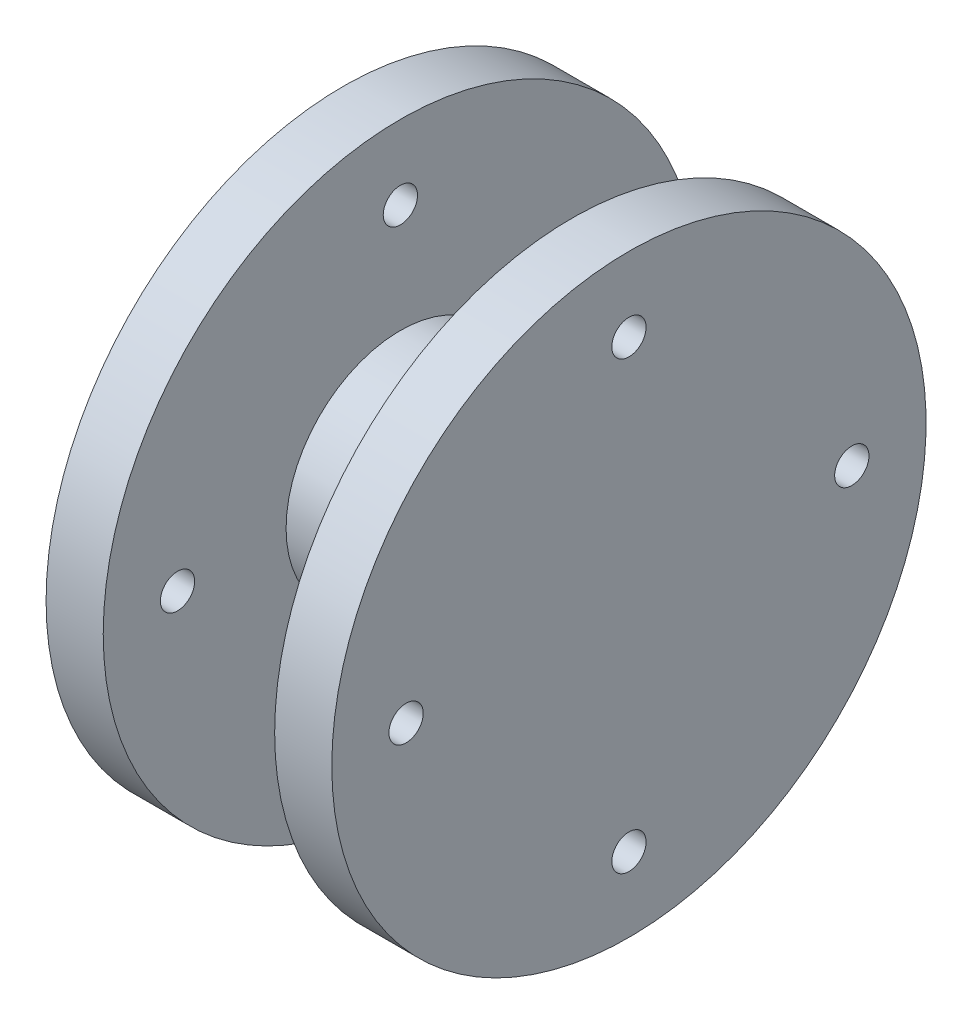
ISO-10303-21;
HEADER;
FILE_DESCRIPTION(('STEP AP214'),'2;1');
FILE_NAME('part.step','',(''),(''),'','','');
FILE_SCHEMA(('AUTOMOTIVE_DESIGN { 1 0 10303 214 1 1 1 1 }'));
ENDSEC;
DATA;
#1=APPLICATION_CONTEXT('core data for automotive mechanical design processes');
#2=APPLICATION_PROTOCOL_DEFINITION('international standard','automotive_design',2000,#1);
#3=PRODUCT_CONTEXT('',#1,'mechanical');
#4=PRODUCT('Part','Part','',(#3));
#5=PRODUCT_RELATED_PRODUCT_CATEGORY('part','',(#4));
#6=PRODUCT_DEFINITION_FORMATION('','',#4);
#7=PRODUCT_DEFINITION_CONTEXT('part definition',#1,'design');
#8=PRODUCT_DEFINITION('design','',#6,#7);
#9=PRODUCT_DEFINITION_SHAPE('','',#8);
#10=(LENGTH_UNIT() NAMED_UNIT(*) SI_UNIT(.MILLI.,.METRE.));
#11=(NAMED_UNIT(*) PLANE_ANGLE_UNIT() SI_UNIT($,.RADIAN.));
#12=(NAMED_UNIT(*) SI_UNIT($,.STERADIAN.) SOLID_ANGLE_UNIT());
#13=UNCERTAINTY_MEASURE_WITH_UNIT(LENGTH_MEASURE(1.E-05),#10,'distance_accuracy_value','');
#14=(GEOMETRIC_REPRESENTATION_CONTEXT(3) GLOBAL_UNCERTAINTY_ASSIGNED_CONTEXT((#13)) GLOBAL_UNIT_ASSIGNED_CONTEXT((#10,
#11,#12)) REPRESENTATION_CONTEXT('',''));
#15=CARTESIAN_POINT('',(0.,0.,0.));
#16=DIRECTION('',(0.,0.,1.));
#17=DIRECTION('',(1.,0.,0.));
#18=AXIS2_PLACEMENT_3D('',#15,#16,#17);
#19=CARTESIAN_POINT('',(0.,0.,0.));
#20=DIRECTION('',(1.,0.,0.));
#21=DIRECTION('',(0.,0.,-1.));
#22=AXIS2_PLACEMENT_3D('',#19,#20,#21);
#23=PLANE('',#22);
#24=CARTESIAN_POINT('',(0.,0.,-19.5));
#25=DIRECTION('',(-1.,0.,0.));
#26=DIRECTION('',(0.,1.,0.));
#27=AXIS2_PLACEMENT_3D('',#24,#25,#26);
#28=CIRCLE('',#27,1.5);
#29=CARTESIAN_POINT('',(0.,1.49999999999993,-19.5));
#30=VERTEX_POINT('',#29);
#31=EDGE_CURVE('E101',#30,#30,#28,.T.);
#32=ORIENTED_EDGE('',*,*,#31,.F.);
#33=EDGE_LOOP('',(#32));
#34=FACE_BOUND('',#33,.T.);
#35=CARTESIAN_POINT('',(0.,-19.5,0.));
#36=DIRECTION('',(-1.,0.,0.));
#37=DIRECTION('',(0.,0.,-1.));
#38=AXIS2_PLACEMENT_3D('',#35,#36,#37);
#39=CIRCLE('',#38,1.5);
#40=CARTESIAN_POINT('',(0.,-19.5,-1.5));
#41=VERTEX_POINT('',#40);
#42=EDGE_CURVE('E95',#41,#41,#39,.T.);
#43=ORIENTED_EDGE('',*,*,#42,.F.);
#44=EDGE_LOOP('',(#43));
#45=FACE_BOUND('',#44,.T.);
#46=CARTESIAN_POINT('',(0.,2.04251658322323E-13,19.5));
#47=DIRECTION('',(-1.,0.,0.));
#48=DIRECTION('',(0.,-1.,0.));
#49=AXIS2_PLACEMENT_3D('',#46,#47,#48);
#50=CIRCLE('',#49,1.5);
#51=CARTESIAN_POINT('',(0.,-1.4999999999998,19.5));
#52=VERTEX_POINT('',#51);
#53=EDGE_CURVE('E89',#52,#52,#50,.T.);
#54=ORIENTED_EDGE('',*,*,#53,.F.);
#55=EDGE_LOOP('',(#54));
#56=FACE_BOUND('',#55,.T.);
#57=CARTESIAN_POINT('',(0.,19.5,0.));
#58=DIRECTION('',(-1.,0.,0.));
#59=DIRECTION('',(0.,0.,1.));
#60=AXIS2_PLACEMENT_3D('',#57,#58,#59);
#61=CIRCLE('',#60,1.5);
#62=CARTESIAN_POINT('',(0.,19.5,1.5));
#63=VERTEX_POINT('',#62);
#64=EDGE_CURVE('E65',#63,#63,#61,.T.);
#65=ORIENTED_EDGE('',*,*,#64,.F.);
#66=EDGE_LOOP('',(#65));
#67=FACE_BOUND('',#66,.T.);
#68=CARTESIAN_POINT('',(0.,0.,0.));
#69=DIRECTION('',(-1.,0.,0.));
#70=DIRECTION('',(0.,0.,1.));
#71=AXIS2_PLACEMENT_3D('',#68,#69,#70);
#72=CIRCLE('',#71,26.);
#73=CARTESIAN_POINT('',(0.,0.,26.));
#74=VERTEX_POINT('',#73);
#75=EDGE_CURVE('E10',#74,#74,#72,.T.);
#76=ORIENTED_EDGE('',*,*,#75,.T.);
#77=EDGE_LOOP('',(#76));
#78=FACE_BOUND('',#77,.T.);
#79=ADVANCED_FACE('F33',(#34,#45,#56,#67,#78),#23,.F.);
#80=CARTESIAN_POINT('',(0.,0.,0.));
#81=DIRECTION('',(-1.,0.,0.));
#82=DIRECTION('',(0.,0.,1.));
#83=AXIS2_PLACEMENT_3D('',#80,#81,#82);
#84=CYLINDRICAL_SURFACE('',#83,26.);
#85=ORIENTED_EDGE('',*,*,#75,.F.);
#86=EDGE_LOOP('',(#85));
#87=FACE_BOUND('',#86,.T.);
#88=CARTESIAN_POINT('',(5.,0.,0.));
#89=DIRECTION('',(-1.,0.,0.));
#90=DIRECTION('',(0.,0.,1.));
#91=AXIS2_PLACEMENT_3D('',#88,#89,#90);
#92=CIRCLE('',#91,26.);
#93=CARTESIAN_POINT('',(5.,0.,26.));
#94=VERTEX_POINT('',#93);
#95=EDGE_CURVE('E39',#94,#94,#92,.T.);
#96=ORIENTED_EDGE('',*,*,#95,.T.);
#97=EDGE_LOOP('',(#96));
#98=FACE_BOUND('',#97,.T.);
#99=ADVANCED_FACE('F150',(#87,#98),#84,.T.);
#100=CARTESIAN_POINT('',(5.,26.,0.));
#101=DIRECTION('',(-1.,0.,0.));
#102=DIRECTION('',(0.,0.,1.));
#103=AXIS2_PLACEMENT_3D('',#100,#101,#102);
#104=PLANE('',#103);
#105=CARTESIAN_POINT('',(5.,0.,-19.5));
#106=DIRECTION('',(-1.,0.,0.));
#107=DIRECTION('',(0.,0.,1.));
#108=AXIS2_PLACEMENT_3D('',#105,#106,#107);
#109=CIRCLE('',#108,1.5);
#110=CARTESIAN_POINT('',(5.,0.,-18.));
#111=VERTEX_POINT('',#110);
#112=EDGE_CURVE('E68',#111,#111,#109,.T.);
#113=ORIENTED_EDGE('',*,*,#112,.T.);
#114=EDGE_LOOP('',(#113));
#115=FACE_BOUND('',#114,.T.);
#116=CARTESIAN_POINT('',(5.,-19.5,0.));
#117=DIRECTION('',(-1.,0.,0.));
#118=DIRECTION('',(0.,0.,1.));
#119=AXIS2_PLACEMENT_3D('',#116,#117,#118);
#120=CIRCLE('',#119,1.5);
#121=CARTESIAN_POINT('',(5.,-19.5,1.5));
#122=VERTEX_POINT('',#121);
#123=EDGE_CURVE('E76',#122,#122,#120,.T.);
#124=ORIENTED_EDGE('',*,*,#123,.T.);
#125=EDGE_LOOP('',(#124));
#126=FACE_BOUND('',#125,.T.);
#127=CARTESIAN_POINT('',(5.,2.04251658322323E-13,19.5));
#128=DIRECTION('',(-1.,0.,0.));
#129=DIRECTION('',(0.,0.,1.));
#130=AXIS2_PLACEMENT_3D('',#127,#128,#129);
#131=CIRCLE('',#130,1.5);
#132=CARTESIAN_POINT('',(5.,2.04251658322323E-13,21.));
#133=VERTEX_POINT('',#132);
#134=EDGE_CURVE('E82',#133,#133,#131,.T.);
#135=ORIENTED_EDGE('',*,*,#134,.T.);
#136=EDGE_LOOP('',(#135));
#137=FACE_BOUND('',#136,.T.);
#138=CARTESIAN_POINT('',(5.,19.5,0.));
#139=DIRECTION('',(-1.,0.,0.));
#140=DIRECTION('',(0.,0.,1.));
#141=AXIS2_PLACEMENT_3D('',#138,#139,#140);
#142=CIRCLE('',#141,1.5);
#143=CARTESIAN_POINT('',(5.,19.5,1.5));
#144=VERTEX_POINT('',#143);
#145=EDGE_CURVE('E58',#144,#144,#142,.T.);
#146=ORIENTED_EDGE('',*,*,#145,.T.);
#147=EDGE_LOOP('',(#146));
#148=FACE_BOUND('',#147,.T.);
#149=ORIENTED_EDGE('',*,*,#95,.F.);
#150=EDGE_LOOP('',(#149));
#151=FACE_BOUND('',#150,.T.);
#152=CARTESIAN_POINT('',(5.,0.,0.));
#153=DIRECTION('',(-1.,0.,0.));
#154=DIRECTION('',(0.,0.,1.));
#155=AXIS2_PLACEMENT_3D('',#152,#153,#154);
#156=CIRCLE('',#155,10.);
#157=CARTESIAN_POINT('',(5.,0.,10.));
#158=VERTEX_POINT('',#157);
#159=EDGE_CURVE('E43',#158,#158,#156,.T.);
#160=ORIENTED_EDGE('',*,*,#159,.T.);
#161=EDGE_LOOP('',(#160));
#162=FACE_BOUND('',#161,.T.);
#163=ADVANCED_FACE('F155',(#115,#126,#137,#148,#151,#162),#104,.F.);
#164=CARTESIAN_POINT('',(0.,0.,0.));
#165=DIRECTION('',(-1.,0.,0.));
#166=DIRECTION('',(0.,0.,1.));
#167=AXIS2_PLACEMENT_3D('',#164,#165,#166);
#168=CYLINDRICAL_SURFACE('',#167,10.);
#169=ORIENTED_EDGE('',*,*,#159,.F.);
#170=EDGE_LOOP('',(#169));
#171=FACE_BOUND('',#170,.T.);
#172=CARTESIAN_POINT('',(20.,0.,0.));
#173=DIRECTION('',(-1.,0.,0.));
#174=DIRECTION('',(0.,0.,1.));
#175=AXIS2_PLACEMENT_3D('',#172,#173,#174);
#176=CIRCLE('',#175,10.);
#177=CARTESIAN_POINT('',(20.,0.,10.));
#178=VERTEX_POINT('',#177);
#179=EDGE_CURVE('E47',#178,#178,#176,.T.);
#180=ORIENTED_EDGE('',*,*,#179,.T.);
#181=EDGE_LOOP('',(#180));
#182=FACE_BOUND('',#181,.T.);
#183=ADVANCED_FACE('F123',(#171,#182),#168,.T.);
#184=CARTESIAN_POINT('',(20.,10.,0.));
#185=DIRECTION('',(1.,0.,0.));
#186=DIRECTION('',(0.,0.,-1.));
#187=AXIS2_PLACEMENT_3D('',#184,#185,#186);
#188=PLANE('',#187);
#189=CARTESIAN_POINT('',(20.,0.,-19.5));
#190=DIRECTION('',(1.,0.,0.));
#191=DIRECTION('',(0.,0.,-1.));
#192=AXIS2_PLACEMENT_3D('',#189,#190,#191);
#193=CIRCLE('',#192,1.5);
#194=CARTESIAN_POINT('',(20.,0.,-21.));
#195=VERTEX_POINT('',#194);
#196=EDGE_CURVE('E73',#195,#195,#193,.T.);
#197=ORIENTED_EDGE('',*,*,#196,.T.);
#198=EDGE_LOOP('',(#197));
#199=FACE_BOUND('',#198,.T.);
#200=CARTESIAN_POINT('',(20.,-19.5,0.));
#201=DIRECTION('',(1.,0.,0.));
#202=DIRECTION('',(0.,0.,-1.));
#203=AXIS2_PLACEMENT_3D('',#200,#201,#202);
#204=CIRCLE('',#203,1.5);
#205=CARTESIAN_POINT('',(20.,-19.5,-1.5));
#206=VERTEX_POINT('',#205);
#207=EDGE_CURVE('E79',#206,#206,#204,.T.);
#208=ORIENTED_EDGE('',*,*,#207,.T.);
#209=EDGE_LOOP('',(#208));
#210=FACE_BOUND('',#209,.T.);
#211=CARTESIAN_POINT('',(20.,2.04251658322323E-13,19.5));
#212=DIRECTION('',(1.,0.,0.));
#213=DIRECTION('',(0.,0.,-1.));
#214=AXIS2_PLACEMENT_3D('',#211,#212,#213);
#215=CIRCLE('',#214,1.5);
#216=CARTESIAN_POINT('',(20.,2.04251658322323E-13,18.));
#217=VERTEX_POINT('',#216);
#218=EDGE_CURVE('E85',#217,#217,#215,.T.);
#219=ORIENTED_EDGE('',*,*,#218,.T.);
#220=EDGE_LOOP('',(#219));
#221=FACE_BOUND('',#220,.T.);
#222=CARTESIAN_POINT('',(20.,19.5,0.));
#223=DIRECTION('',(1.,0.,0.));
#224=DIRECTION('',(0.,0.,-1.));
#225=AXIS2_PLACEMENT_3D('',#222,#223,#224);
#226=CIRCLE('',#225,1.5);
#227=CARTESIAN_POINT('',(20.,19.5,-1.5));
#228=VERTEX_POINT('',#227);
#229=EDGE_CURVE('E61',#228,#228,#226,.T.);
#230=ORIENTED_EDGE('',*,*,#229,.T.);
#231=EDGE_LOOP('',(#230));
#232=FACE_BOUND('',#231,.T.);
#233=ORIENTED_EDGE('',*,*,#179,.F.);
#234=EDGE_LOOP('',(#233));
#235=FACE_BOUND('',#234,.T.);
#236=CARTESIAN_POINT('',(20.,0.,0.));
#237=DIRECTION('',(-1.,0.,0.));
#238=DIRECTION('',(0.,0.,1.));
#239=AXIS2_PLACEMENT_3D('',#236,#237,#238);
#240=CIRCLE('',#239,26.);
#241=CARTESIAN_POINT('',(20.,0.,26.));
#242=VERTEX_POINT('',#241);
#243=EDGE_CURVE('E52',#242,#242,#240,.T.);
#244=ORIENTED_EDGE('',*,*,#243,.T.);
#245=EDGE_LOOP('',(#244));
#246=FACE_BOUND('',#245,.T.);
#247=ADVANCED_FACE('F119',(#199,#210,#221,#232,#235,#246),#188,.F.);
#248=CARTESIAN_POINT('',(0.,0.,0.));
#249=DIRECTION('',(-1.,0.,0.));
#250=DIRECTION('',(0.,0.,1.));
#251=AXIS2_PLACEMENT_3D('',#248,#249,#250);
#252=CYLINDRICAL_SURFACE('',#251,26.);
#253=ORIENTED_EDGE('',*,*,#243,.F.);
#254=EDGE_LOOP('',(#253));
#255=FACE_BOUND('',#254,.T.);
#256=CARTESIAN_POINT('',(25.,0.,0.));
#257=DIRECTION('',(-1.,0.,0.));
#258=DIRECTION('',(0.,0.,1.));
#259=AXIS2_PLACEMENT_3D('',#256,#257,#258);
#260=CIRCLE('',#259,26.);
#261=CARTESIAN_POINT('',(25.,0.,26.));
#262=VERTEX_POINT('',#261);
#263=EDGE_CURVE('E55',#262,#262,#260,.T.);
#264=ORIENTED_EDGE('',*,*,#263,.T.);
#265=EDGE_LOOP('',(#264));
#266=FACE_BOUND('',#265,.T.);
#267=ADVANCED_FACE('F122',(#255,#266),#252,.T.);
#268=CARTESIAN_POINT('',(25.,26.,0.));
#269=DIRECTION('',(-1.,0.,0.));
#270=DIRECTION('',(0.,0.,1.));
#271=AXIS2_PLACEMENT_3D('',#268,#269,#270);
#272=PLANE('',#271);
#273=CARTESIAN_POINT('',(25.,0.,-19.5));
#274=DIRECTION('',(-1.,0.,0.));
#275=DIRECTION('',(0.,1.,0.));
#276=AXIS2_PLACEMENT_3D('',#273,#274,#275);
#277=CIRCLE('',#276,1.5);
#278=CARTESIAN_POINT('',(25.,1.49999999999993,-19.5));
#279=VERTEX_POINT('',#278);
#280=EDGE_CURVE('E88',#279,#279,#277,.T.);
#281=ORIENTED_EDGE('',*,*,#280,.T.);
#282=EDGE_LOOP('',(#281));
#283=FACE_BOUND('',#282,.T.);
#284=CARTESIAN_POINT('',(25.,-19.5,0.));
#285=DIRECTION('',(-1.,0.,0.));
#286=DIRECTION('',(0.,0.,-1.));
#287=AXIS2_PLACEMENT_3D('',#284,#285,#286);
#288=CIRCLE('',#287,1.5);
#289=CARTESIAN_POINT('',(25.,-19.5,-1.5));
#290=VERTEX_POINT('',#289);
#291=EDGE_CURVE('E98',#290,#290,#288,.T.);
#292=ORIENTED_EDGE('',*,*,#291,.T.);
#293=EDGE_LOOP('',(#292));
#294=FACE_BOUND('',#293,.T.);
#295=CARTESIAN_POINT('',(25.,2.04251658322323E-13,19.5));
#296=DIRECTION('',(-1.,0.,0.));
#297=DIRECTION('',(0.,-1.,0.));
#298=AXIS2_PLACEMENT_3D('',#295,#296,#297);
#299=CIRCLE('',#298,1.5);
#300=CARTESIAN_POINT('',(25.,-1.4999999999998,19.5));
#301=VERTEX_POINT('',#300);
#302=EDGE_CURVE('E92',#301,#301,#299,.T.);
#303=ORIENTED_EDGE('',*,*,#302,.T.);
#304=EDGE_LOOP('',(#303));
#305=FACE_BOUND('',#304,.T.);
#306=CARTESIAN_POINT('',(25.,19.5,0.));
#307=DIRECTION('',(-1.,0.,0.));
#308=DIRECTION('',(0.,0.,1.));
#309=AXIS2_PLACEMENT_3D('',#306,#307,#308);
#310=CIRCLE('',#309,1.5);
#311=CARTESIAN_POINT('',(25.,19.5,1.5));
#312=VERTEX_POINT('',#311);
#313=EDGE_CURVE('E64',#312,#312,#310,.T.);
#314=ORIENTED_EDGE('',*,*,#313,.T.);
#315=EDGE_LOOP('',(#314));
#316=FACE_BOUND('',#315,.T.);
#317=ORIENTED_EDGE('',*,*,#263,.F.);
#318=EDGE_LOOP('',(#317));
#319=FACE_BOUND('',#318,.T.);
#320=ADVANCED_FACE('F107',(#283,#294,#305,#316,#319),#272,.F.);
#321=CARTESIAN_POINT('',(25.,19.5,0.));
#322=DIRECTION('',(-1.,0.,0.));
#323=DIRECTION('',(0.,0.,1.));
#324=AXIS2_PLACEMENT_3D('',#321,#322,#323);
#325=CYLINDRICAL_SURFACE('',#324,1.5);
#326=ORIENTED_EDGE('',*,*,#313,.F.);
#327=EDGE_LOOP('',(#326));
#328=FACE_BOUND('',#327,.T.);
#329=ORIENTED_EDGE('',*,*,#229,.F.);
#330=EDGE_LOOP('',(#329));
#331=FACE_BOUND('',#330,.T.);
#332=ADVANCED_FACE('F141',(#328,#331),#325,.F.);
#333=ORIENTED_EDGE('',*,*,#64,.T.);
#334=EDGE_LOOP('',(#333));
#335=FACE_BOUND('',#334,.T.);
#336=ORIENTED_EDGE('',*,*,#145,.F.);
#337=EDGE_LOOP('',(#336));
#338=FACE_BOUND('',#337,.T.);
#339=ADVANCED_FACE('F146',(#335,#338),#325,.F.);
#340=CARTESIAN_POINT('',(25.,2.04251658322323E-13,19.5));
#341=DIRECTION('',(-1.,0.,0.));
#342=DIRECTION('',(0.,0.,1.));
#343=AXIS2_PLACEMENT_3D('',#340,#341,#342);
#344=CYLINDRICAL_SURFACE('',#343,1.5);
#345=ORIENTED_EDGE('',*,*,#302,.F.);
#346=EDGE_LOOP('',(#345));
#347=FACE_BOUND('',#346,.T.);
#348=ORIENTED_EDGE('',*,*,#218,.F.);
#349=EDGE_LOOP('',(#348));
#350=FACE_BOUND('',#349,.T.);
#351=ADVANCED_FACE('F167',(#347,#350),#344,.F.);
#352=CARTESIAN_POINT('',(25.,-19.5,0.));
#353=DIRECTION('',(-1.,0.,0.));
#354=DIRECTION('',(0.,0.,1.));
#355=AXIS2_PLACEMENT_3D('',#352,#353,#354);
#356=CYLINDRICAL_SURFACE('',#355,1.5);
#357=ORIENTED_EDGE('',*,*,#291,.F.);
#358=EDGE_LOOP('',(#357));
#359=FACE_BOUND('',#358,.T.);
#360=ORIENTED_EDGE('',*,*,#207,.F.);
#361=EDGE_LOOP('',(#360));
#362=FACE_BOUND('',#361,.T.);
#363=ADVANCED_FACE('F114',(#359,#362),#356,.F.);
#364=CARTESIAN_POINT('',(25.,0.,-19.5));
#365=DIRECTION('',(-1.,0.,0.));
#366=DIRECTION('',(0.,0.,1.));
#367=AXIS2_PLACEMENT_3D('',#364,#365,#366);
#368=CYLINDRICAL_SURFACE('',#367,1.5);
#369=ORIENTED_EDGE('',*,*,#280,.F.);
#370=EDGE_LOOP('',(#369));
#371=FACE_BOUND('',#370,.T.);
#372=ORIENTED_EDGE('',*,*,#196,.F.);
#373=EDGE_LOOP('',(#372));
#374=FACE_BOUND('',#373,.T.);
#375=ADVANCED_FACE('F110',(#371,#374),#368,.F.);
#376=ORIENTED_EDGE('',*,*,#53,.T.);
#377=EDGE_LOOP('',(#376));
#378=FACE_BOUND('',#377,.T.);
#379=ORIENTED_EDGE('',*,*,#134,.F.);
#380=EDGE_LOOP('',(#379));
#381=FACE_BOUND('',#380,.T.);
#382=ADVANCED_FACE('F113',(#378,#381),#344,.F.);
#383=ORIENTED_EDGE('',*,*,#42,.T.);
#384=EDGE_LOOP('',(#383));
#385=FACE_BOUND('',#384,.T.);
#386=ORIENTED_EDGE('',*,*,#123,.F.);
#387=EDGE_LOOP('',(#386));
#388=FACE_BOUND('',#387,.T.);
#389=ADVANCED_FACE('F239',(#385,#388),#356,.F.);
#390=ORIENTED_EDGE('',*,*,#31,.T.);
#391=EDGE_LOOP('',(#390));
#392=FACE_BOUND('',#391,.T.);
#393=ORIENTED_EDGE('',*,*,#112,.F.);
#394=EDGE_LOOP('',(#393));
#395=FACE_BOUND('',#394,.T.);
#396=ADVANCED_FACE('F116',(#392,#395),#368,.F.);
#397=CLOSED_SHELL('',(#79,#99,#163,#183,#247,#267,#320,#332,#339,#351,#363,#375,#382,#389,#396));
#398=MANIFOLD_SOLID_BREP('B2',#397);
#399=ADVANCED_BREP_SHAPE_REPRESENTATION('',(#18,#398),#14);
#400=SHAPE_DEFINITION_REPRESENTATION(#9,#399);
ENDSEC;
END-ISO-10303-21;
